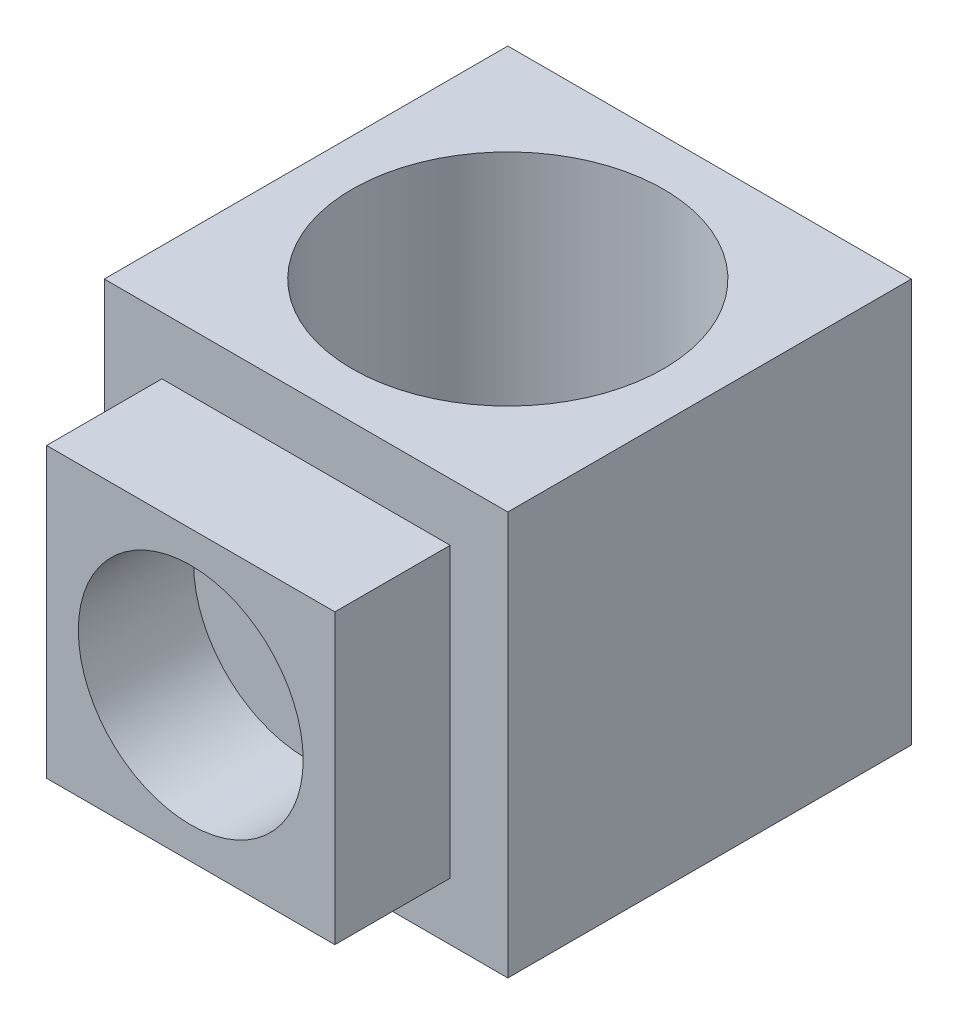
ISO-10303-21;
HEADER;
FILE_DESCRIPTION(('STEP AP214'),'2;1');
FILE_NAME('part.step','',(''),(''),'','','');
FILE_SCHEMA(('AUTOMOTIVE_DESIGN { 1 0 10303 214 1 1 1 1 }'));
ENDSEC;
DATA;
#1=APPLICATION_CONTEXT('core data for automotive mechanical design processes');
#2=APPLICATION_PROTOCOL_DEFINITION('international standard','automotive_design',2000,#1);
#3=PRODUCT_CONTEXT('',#1,'mechanical');
#4=PRODUCT('Part','Part','',(#3));
#5=PRODUCT_RELATED_PRODUCT_CATEGORY('part','',(#4));
#6=PRODUCT_DEFINITION_FORMATION('','',#4);
#7=PRODUCT_DEFINITION_CONTEXT('part definition',#1,'design');
#8=PRODUCT_DEFINITION('design','',#6,#7);
#9=PRODUCT_DEFINITION_SHAPE('','',#8);
#10=(LENGTH_UNIT() NAMED_UNIT(*) SI_UNIT(.MILLI.,.METRE.));
#11=(NAMED_UNIT(*) PLANE_ANGLE_UNIT() SI_UNIT($,.RADIAN.));
#12=(NAMED_UNIT(*) SI_UNIT($,.STERADIAN.) SOLID_ANGLE_UNIT());
#13=UNCERTAINTY_MEASURE_WITH_UNIT(LENGTH_MEASURE(1.E-05),#10,'distance_accuracy_value','');
#14=(GEOMETRIC_REPRESENTATION_CONTEXT(3) GLOBAL_UNCERTAINTY_ASSIGNED_CONTEXT((#13)) GLOBAL_UNIT_ASSIGNED_CONTEXT((#10,
#11,#12)) REPRESENTATION_CONTEXT('',''));
#15=CARTESIAN_POINT('',(0.,0.,0.));
#16=DIRECTION('',(0.,0.,1.));
#17=DIRECTION('',(1.,0.,0.));
#18=AXIS2_PLACEMENT_3D('',#15,#16,#17);
#19=CARTESIAN_POINT('',(0.,14.,0.));
#20=DIRECTION('',(1.,0.,0.));
#21=DIRECTION('',(0.,0.,-1.));
#22=AXIS2_PLACEMENT_3D('',#19,#20,#21);
#23=PLANE('',#22);
#24=DIRECTION('',(0.,0.,1.));
#25=VECTOR('',#24,1.);
#26=CARTESIAN_POINT('',(0.,0.,0.));
#27=LINE('',#26,#25);
#28=CARTESIAN_POINT('',(0.,0.,-14.));
#29=VERTEX_POINT('',#28);
#30=CARTESIAN_POINT('',(0.,0.,0.));
#31=VERTEX_POINT('',#30);
#32=EDGE_CURVE('E135',#29,#31,#27,.T.);
#33=ORIENTED_EDGE('',*,*,#32,.T.);
#34=DIRECTION('',(0.,-1.,0.));
#35=VECTOR('',#34,1.);
#36=CARTESIAN_POINT('',(0.,14.,0.));
#37=LINE('',#36,#35);
#38=CARTESIAN_POINT('',(0.,14.,0.));
#39=VERTEX_POINT('',#38);
#40=EDGE_CURVE('E11',#39,#31,#37,.T.);
#41=ORIENTED_EDGE('',*,*,#40,.F.);
#42=DIRECTION('',(0.,0.,1.));
#43=VECTOR('',#42,1.);
#44=CARTESIAN_POINT('',(0.,14.,0.));
#45=LINE('',#44,#43);
#46=CARTESIAN_POINT('',(0.,14.,-14.));
#47=VERTEX_POINT('',#46);
#48=EDGE_CURVE('E146',#47,#39,#45,.T.);
#49=ORIENTED_EDGE('',*,*,#48,.F.);
#50=DIRECTION('',(0.,-1.,0.));
#51=VECTOR('',#50,1.);
#52=CARTESIAN_POINT('',(0.,14.,-14.));
#53=LINE('',#52,#51);
#54=EDGE_CURVE('E159',#47,#29,#53,.T.);
#55=ORIENTED_EDGE('',*,*,#54,.T.);
#56=EDGE_LOOP('',(#33,#41,#49,#55));
#57=FACE_BOUND('',#56,.T.);
#58=ADVANCED_FACE('F45',(#57),#23,.F.);
#59=CARTESIAN_POINT('',(0.,14.,0.));
#60=DIRECTION('',(0.,0.,-1.));
#61=DIRECTION('',(-1.,0.,0.));
#62=AXIS2_PLACEMENT_3D('',#59,#60,#61);
#63=PLANE('',#62);
#64=DIRECTION('',(0.,-1.,0.));
#65=VECTOR('',#64,1.);
#66=CARTESIAN_POINT('',(2.,12.,0.));
#67=LINE('',#66,#65);
#68=CARTESIAN_POINT('',(2.,12.,0.));
#69=VERTEX_POINT('',#68);
#70=CARTESIAN_POINT('',(2.,2.,0.));
#71=VERTEX_POINT('',#70);
#72=EDGE_CURVE('E133',#69,#71,#67,.T.);
#73=ORIENTED_EDGE('',*,*,#72,.F.);
#74=DIRECTION('',(-1.,0.,0.));
#75=VECTOR('',#74,1.);
#76=CARTESIAN_POINT('',(2.,12.,0.));
#77=LINE('',#76,#75);
#78=CARTESIAN_POINT('',(12.,12.,0.));
#79=VERTEX_POINT('',#78);
#80=EDGE_CURVE('E130',#79,#69,#77,.T.);
#81=ORIENTED_EDGE('',*,*,#80,.F.);
#82=DIRECTION('',(0.,1.,0.));
#83=VECTOR('',#82,1.);
#84=CARTESIAN_POINT('',(12.,12.,0.));
#85=LINE('',#84,#83);
#86=CARTESIAN_POINT('',(12.,2.,0.));
#87=VERTEX_POINT('',#86);
#88=EDGE_CURVE('E65',#87,#79,#85,.T.);
#89=ORIENTED_EDGE('',*,*,#88,.F.);
#90=DIRECTION('',(1.,0.,0.));
#91=VECTOR('',#90,1.);
#92=CARTESIAN_POINT('',(2.,2.,0.));
#93=LINE('',#92,#91);
#94=EDGE_CURVE('E60',#71,#87,#93,.T.);
#95=ORIENTED_EDGE('',*,*,#94,.F.);
#96=EDGE_LOOP('',(#73,#81,#89,#95));
#97=FACE_BOUND('',#96,.T.);
#98=DIRECTION('',(1.,0.,0.));
#99=VECTOR('',#98,1.);
#100=CARTESIAN_POINT('',(0.,0.,0.));
#101=LINE('',#100,#99);
#102=CARTESIAN_POINT('',(14.,0.,0.));
#103=VERTEX_POINT('',#102);
#104=EDGE_CURVE('E140',#31,#103,#101,.T.);
#105=ORIENTED_EDGE('',*,*,#104,.T.);
#106=DIRECTION('',(0.,-1.,0.));
#107=VECTOR('',#106,1.);
#108=CARTESIAN_POINT('',(14.,14.,0.));
#109=LINE('',#108,#107);
#110=CARTESIAN_POINT('',(14.,14.,0.));
#111=VERTEX_POINT('',#110);
#112=EDGE_CURVE('E53',#111,#103,#109,.T.);
#113=ORIENTED_EDGE('',*,*,#112,.F.);
#114=DIRECTION('',(1.,0.,0.));
#115=VECTOR('',#114,1.);
#116=CARTESIAN_POINT('',(0.,14.,0.));
#117=LINE('',#116,#115);
#118=EDGE_CURVE('E150',#39,#111,#117,.T.);
#119=ORIENTED_EDGE('',*,*,#118,.F.);
#120=ORIENTED_EDGE('',*,*,#40,.T.);
#121=EDGE_LOOP('',(#105,#113,#119,#120));
#122=FACE_BOUND('',#121,.T.);
#123=ADVANCED_FACE('F196',(#97,#122),#63,.F.);
#124=CARTESIAN_POINT('',(14.,14.,0.));
#125=DIRECTION('',(-1.,0.,0.));
#126=DIRECTION('',(0.,0.,1.));
#127=AXIS2_PLACEMENT_3D('',#124,#125,#126);
#128=PLANE('',#127);
#129=DIRECTION('',(0.,0.,-1.));
#130=VECTOR('',#129,1.);
#131=CARTESIAN_POINT('',(14.,0.,0.));
#132=LINE('',#131,#130);
#133=CARTESIAN_POINT('',(14.,0.,-14.));
#134=VERTEX_POINT('',#133);
#135=EDGE_CURVE('E163',#103,#134,#132,.T.);
#136=ORIENTED_EDGE('',*,*,#135,.T.);
#137=DIRECTION('',(0.,-1.,0.));
#138=VECTOR('',#137,1.);
#139=CARTESIAN_POINT('',(14.,14.,-14.));
#140=LINE('',#139,#138);
#141=CARTESIAN_POINT('',(14.,14.,-14.));
#142=VERTEX_POINT('',#141);
#143=EDGE_CURVE('E171',#142,#134,#140,.T.);
#144=ORIENTED_EDGE('',*,*,#143,.F.);
#145=DIRECTION('',(0.,0.,-1.));
#146=VECTOR('',#145,1.);
#147=CARTESIAN_POINT('',(14.,14.,0.));
#148=LINE('',#147,#146);
#149=EDGE_CURVE('E154',#111,#142,#148,.T.);
#150=ORIENTED_EDGE('',*,*,#149,.F.);
#151=ORIENTED_EDGE('',*,*,#112,.T.);
#152=EDGE_LOOP('',(#136,#144,#150,#151));
#153=FACE_BOUND('',#152,.T.);
#154=ADVANCED_FACE('F180',(#153),#128,.F.);
#155=CARTESIAN_POINT('',(0.,14.,-14.));
#156=DIRECTION('',(0.,0.,1.));
#157=DIRECTION('',(1.,0.,0.));
#158=AXIS2_PLACEMENT_3D('',#155,#156,#157);
#159=PLANE('',#158);
#160=DIRECTION('',(-1.,0.,0.));
#161=VECTOR('',#160,1.);
#162=CARTESIAN_POINT('',(0.,0.,-14.));
#163=LINE('',#162,#161);
#164=EDGE_CURVE('E151',#134,#29,#163,.T.);
#165=ORIENTED_EDGE('',*,*,#164,.T.);
#166=ORIENTED_EDGE('',*,*,#54,.F.);
#167=DIRECTION('',(-1.,0.,0.));
#168=VECTOR('',#167,1.);
#169=CARTESIAN_POINT('',(0.,14.,-14.));
#170=LINE('',#169,#168);
#171=EDGE_CURVE('E157',#142,#47,#170,.T.);
#172=ORIENTED_EDGE('',*,*,#171,.F.);
#173=ORIENTED_EDGE('',*,*,#143,.T.);
#174=EDGE_LOOP('',(#165,#166,#172,#173));
#175=FACE_BOUND('',#174,.T.);
#176=ADVANCED_FACE('F189',(#175),#159,.F.);
#177=CARTESIAN_POINT('',(0.,14.,0.));
#178=DIRECTION('',(0.,-1.,0.));
#179=DIRECTION('',(0.,0.,-1.));
#180=AXIS2_PLACEMENT_3D('',#177,#178,#179);
#181=PLANE('',#180);
#182=CARTESIAN_POINT('',(7.,14.,-7.));
#183=DIRECTION('',(0.,1.,0.));
#184=DIRECTION('',(0.,0.,1.));
#185=AXIS2_PLACEMENT_3D('',#182,#183,#184);
#186=CIRCLE('',#185,5.4);
#187=CARTESIAN_POINT('',(7.,14.,-1.6));
#188=VERTEX_POINT('',#187);
#189=EDGE_CURVE('E233',#188,#188,#186,.T.);
#190=ORIENTED_EDGE('',*,*,#189,.F.);
#191=EDGE_LOOP('',(#190));
#192=FACE_BOUND('',#191,.T.);
#193=ORIENTED_EDGE('',*,*,#48,.T.);
#194=ORIENTED_EDGE('',*,*,#118,.T.);
#195=ORIENTED_EDGE('',*,*,#149,.T.);
#196=ORIENTED_EDGE('',*,*,#171,.T.);
#197=EDGE_LOOP('',(#193,#194,#195,#196));
#198=FACE_BOUND('',#197,.T.);
#199=ADVANCED_FACE('F195',(#192,#198),#181,.F.);
#200=CARTESIAN_POINT('',(0.,0.,0.));
#201=DIRECTION('',(0.,-1.,0.));
#202=DIRECTION('',(0.,0.,-1.));
#203=AXIS2_PLACEMENT_3D('',#200,#201,#202);
#204=PLANE('',#203);
#205=CARTESIAN_POINT('',(7.,0.,-7.));
#206=DIRECTION('',(0.,-1.,0.));
#207=DIRECTION('',(0.,0.,-1.));
#208=AXIS2_PLACEMENT_3D('',#205,#206,#207);
#209=CIRCLE('',#208,5.4);
#210=CARTESIAN_POINT('',(7.,0.,-1.6));
#211=VERTEX_POINT('',#210);
#212=EDGE_CURVE('E226',#211,#211,#209,.F.);
#213=ORIENTED_EDGE('',*,*,#212,.T.);
#214=EDGE_LOOP('',(#213));
#215=FACE_BOUND('',#214,.T.);
#216=ORIENTED_EDGE('',*,*,#32,.F.);
#217=ORIENTED_EDGE('',*,*,#164,.F.);
#218=ORIENTED_EDGE('',*,*,#135,.F.);
#219=ORIENTED_EDGE('',*,*,#104,.F.);
#220=EDGE_LOOP('',(#216,#217,#218,#219));
#221=FACE_BOUND('',#220,.T.);
#222=ADVANCED_FACE('F186',(#215,#221),#204,.T.);
#223=CARTESIAN_POINT('',(0.,0.,4.));
#224=DIRECTION('',(0.,0.,1.));
#225=DIRECTION('',(1.,0.,0.));
#226=AXIS2_PLACEMENT_3D('',#223,#224,#225);
#227=PLANE('',#226);
#228=DIRECTION('',(0.,-1.,0.));
#229=VECTOR('',#228,1.);
#230=CARTESIAN_POINT('',(2.,12.,4.));
#231=LINE('',#230,#229);
#232=CARTESIAN_POINT('',(2.,12.,4.));
#233=VERTEX_POINT('',#232);
#234=CARTESIAN_POINT('',(2.,2.,4.));
#235=VERTEX_POINT('',#234);
#236=EDGE_CURVE('E119',#233,#235,#231,.T.);
#237=ORIENTED_EDGE('',*,*,#236,.T.);
#238=DIRECTION('',(1.,0.,0.));
#239=VECTOR('',#238,1.);
#240=CARTESIAN_POINT('',(2.,2.,4.));
#241=LINE('',#240,#239);
#242=CARTESIAN_POINT('',(12.,2.,4.));
#243=VERTEX_POINT('',#242);
#244=EDGE_CURVE('E107',#235,#243,#241,.T.);
#245=ORIENTED_EDGE('',*,*,#244,.T.);
#246=DIRECTION('',(0.,1.,0.));
#247=VECTOR('',#246,1.);
#248=CARTESIAN_POINT('',(12.,12.,4.));
#249=LINE('',#248,#247);
#250=CARTESIAN_POINT('',(12.,12.,4.));
#251=VERTEX_POINT('',#250);
#252=EDGE_CURVE('E118',#243,#251,#249,.T.);
#253=ORIENTED_EDGE('',*,*,#252,.T.);
#254=DIRECTION('',(-1.,0.,0.));
#255=VECTOR('',#254,1.);
#256=CARTESIAN_POINT('',(2.,12.,4.));
#257=LINE('',#256,#255);
#258=EDGE_CURVE('E125',#251,#233,#257,.T.);
#259=ORIENTED_EDGE('',*,*,#258,.T.);
#260=EDGE_LOOP('',(#237,#245,#253,#259));
#261=FACE_BOUND('',#260,.T.);
#262=CARTESIAN_POINT('',(7.,7.,4.));
#263=DIRECTION('',(0.,0.,1.));
#264=DIRECTION('',(1.,0.,0.));
#265=AXIS2_PLACEMENT_3D('',#262,#263,#264);
#266=CIRCLE('',#265,3.9);
#267=CARTESIAN_POINT('',(10.9,7.,4.));
#268=VERTEX_POINT('',#267);
#269=EDGE_CURVE('E225',#268,#268,#266,.T.);
#270=ORIENTED_EDGE('',*,*,#269,.F.);
#271=EDGE_LOOP('',(#270));
#272=FACE_BOUND('',#271,.T.);
#273=ADVANCED_FACE('F122',(#261,#272),#227,.T.);
#274=CARTESIAN_POINT('',(2.,12.,4.));
#275=DIRECTION('',(1.,0.,0.));
#276=DIRECTION('',(0.,1.,0.));
#277=AXIS2_PLACEMENT_3D('',#274,#275,#276);
#278=PLANE('',#277);
#279=ORIENTED_EDGE('',*,*,#72,.T.);
#280=DIRECTION('',(0.,0.,-1.));
#281=VECTOR('',#280,1.);
#282=CARTESIAN_POINT('',(2.,2.,4.));
#283=LINE('',#282,#281);
#284=EDGE_CURVE('E111',#235,#71,#283,.T.);
#285=ORIENTED_EDGE('',*,*,#284,.F.);
#286=ORIENTED_EDGE('',*,*,#236,.F.);
#287=DIRECTION('',(0.,0.,-1.));
#288=VECTOR('',#287,1.);
#289=CARTESIAN_POINT('',(2.,12.,4.));
#290=LINE('',#289,#288);
#291=EDGE_CURVE('E240',#233,#69,#290,.T.);
#292=ORIENTED_EDGE('',*,*,#291,.T.);
#293=EDGE_LOOP('',(#279,#285,#286,#292));
#294=FACE_BOUND('',#293,.T.);
#295=ADVANCED_FACE('F132',(#294),#278,.F.);
#296=CARTESIAN_POINT('',(2.,2.,4.));
#297=DIRECTION('',(0.,1.,0.));
#298=DIRECTION('',(-1.,0.,0.));
#299=AXIS2_PLACEMENT_3D('',#296,#297,#298);
#300=PLANE('',#299);
#301=ORIENTED_EDGE('',*,*,#94,.T.);
#302=DIRECTION('',(0.,0.,-1.));
#303=VECTOR('',#302,1.);
#304=CARTESIAN_POINT('',(12.,2.,4.));
#305=LINE('',#304,#303);
#306=EDGE_CURVE('E114',#243,#87,#305,.T.);
#307=ORIENTED_EDGE('',*,*,#306,.F.);
#308=ORIENTED_EDGE('',*,*,#244,.F.);
#309=ORIENTED_EDGE('',*,*,#284,.T.);
#310=EDGE_LOOP('',(#301,#307,#308,#309));
#311=FACE_BOUND('',#310,.T.);
#312=ADVANCED_FACE('F109',(#311),#300,.F.);
#313=CARTESIAN_POINT('',(12.,12.,4.));
#314=DIRECTION('',(-1.,0.,0.));
#315=DIRECTION('',(0.,0.,1.));
#316=AXIS2_PLACEMENT_3D('',#313,#314,#315);
#317=PLANE('',#316);
#318=ORIENTED_EDGE('',*,*,#88,.T.);
#319=DIRECTION('',(0.,0.,-1.));
#320=VECTOR('',#319,1.);
#321=CARTESIAN_POINT('',(12.,12.,4.));
#322=LINE('',#321,#320);
#323=EDGE_CURVE('E142',#251,#79,#322,.T.);
#324=ORIENTED_EDGE('',*,*,#323,.F.);
#325=ORIENTED_EDGE('',*,*,#252,.F.);
#326=ORIENTED_EDGE('',*,*,#306,.T.);
#327=EDGE_LOOP('',(#318,#324,#325,#326));
#328=FACE_BOUND('',#327,.T.);
#329=ADVANCED_FACE('F256',(#328),#317,.F.);
#330=CARTESIAN_POINT('',(2.,12.,4.));
#331=DIRECTION('',(0.,-1.,0.));
#332=DIRECTION('',(1.,0.,0.));
#333=AXIS2_PLACEMENT_3D('',#330,#331,#332);
#334=PLANE('',#333);
#335=ORIENTED_EDGE('',*,*,#80,.T.);
#336=ORIENTED_EDGE('',*,*,#291,.F.);
#337=ORIENTED_EDGE('',*,*,#258,.F.);
#338=ORIENTED_EDGE('',*,*,#323,.T.);
#339=EDGE_LOOP('',(#335,#336,#337,#338));
#340=FACE_BOUND('',#339,.T.);
#341=ADVANCED_FACE('F217',(#340),#334,.F.);
#342=CARTESIAN_POINT('',(7.,7.,4.));
#343=DIRECTION('',(0.,0.,-1.));
#344=DIRECTION('',(-1.,0.,0.));
#345=AXIS2_PLACEMENT_3D('',#342,#343,#344);
#346=CYLINDRICAL_SURFACE('',#345,3.9);
#347=ORIENTED_EDGE('',*,*,#269,.T.);
#348=EDGE_LOOP('',(#347));
#349=FACE_BOUND('',#348,.T.);
#350=CARTESIAN_POINT('',(7.,7.,0.));
#351=DIRECTION('',(0.,0.,1.));
#352=DIRECTION('',(1.,0.,0.));
#353=AXIS2_PLACEMENT_3D('',#350,#351,#352);
#354=CIRCLE('',#353,3.9);
#355=CARTESIAN_POINT('',(10.9,7.,0.));
#356=VERTEX_POINT('',#355);
#357=EDGE_CURVE('E222',#356,#356,#354,.T.);
#358=ORIENTED_EDGE('',*,*,#357,.F.);
#359=EDGE_LOOP('',(#358));
#360=FACE_BOUND('',#359,.T.);
#361=ADVANCED_FACE('F208',(#349,#360),#346,.F.);
#362=ORIENTED_EDGE('',*,*,#357,.T.);
#363=EDGE_LOOP('',(#362));
#364=FACE_BOUND('',#363,.T.);
#365=ADVANCED_FACE('F198',(#364),#63,.F.);
#366=CARTESIAN_POINT('',(7.,-15.2735064736294,-7.));
#367=DIRECTION('',(0.,1.,0.));
#368=DIRECTION('',(0.,0.,1.));
#369=AXIS2_PLACEMENT_3D('',#366,#367,#368);
#370=CYLINDRICAL_SURFACE('',#369,5.4);
#371=CARTESIAN_POINT('',(7.,14.,-1.6));
#372=CARTESIAN_POINT('',(7.,13.8541666666667,-1.6));
#373=CARTESIAN_POINT('',(7.,13.7083333333333,-1.6));
#374=CARTESIAN_POINT('',(7.,13.4166666666667,-1.6));
#375=CARTESIAN_POINT('',(7.,13.2708333333333,-1.6));
#376=CARTESIAN_POINT('',(7.,12.9791666666667,-1.6));
#377=CARTESIAN_POINT('',(7.,12.8333333333333,-1.6));
#378=CARTESIAN_POINT('',(7.,12.5416666666667,-1.6));
#379=CARTESIAN_POINT('',(7.,12.3958333333333,-1.6));
#380=CARTESIAN_POINT('',(7.,12.1041666666667,-1.6));
#381=CARTESIAN_POINT('',(7.,11.9583333333333,-1.6));
#382=CARTESIAN_POINT('',(7.,11.6666666666667,-1.6));
#383=CARTESIAN_POINT('',(7.,11.5208333333333,-1.6));
#384=CARTESIAN_POINT('',(7.,11.2291666666667,-1.6));
#385=CARTESIAN_POINT('',(7.,11.0833333333333,-1.6));
#386=CARTESIAN_POINT('',(7.,10.7916666666667,-1.6));
#387=CARTESIAN_POINT('',(7.,10.6458333333333,-1.6));
#388=CARTESIAN_POINT('',(7.,10.3541666666667,-1.6));
#389=CARTESIAN_POINT('',(7.,10.2083333333333,-1.6));
#390=CARTESIAN_POINT('',(7.,9.91666666666667,-1.6));
#391=CARTESIAN_POINT('',(7.,9.77083333333333,-1.6));
#392=CARTESIAN_POINT('',(7.,9.47916666666667,-1.6));
#393=CARTESIAN_POINT('',(7.,9.33333333333333,-1.6));
#394=CARTESIAN_POINT('',(7.,9.04166666666667,-1.6));
#395=CARTESIAN_POINT('',(7.,8.89583333333333,-1.6));
#396=CARTESIAN_POINT('',(7.,8.60416666666667,-1.6));
#397=CARTESIAN_POINT('',(7.,8.45833333333333,-1.6));
#398=CARTESIAN_POINT('',(7.,8.16666666666667,-1.6));
#399=CARTESIAN_POINT('',(7.,8.02083333333333,-1.6));
#400=CARTESIAN_POINT('',(7.,7.72916666666667,-1.6));
#401=CARTESIAN_POINT('',(7.,7.58333333333333,-1.6));
#402=CARTESIAN_POINT('',(7.,7.29166666666667,-1.6));
#403=CARTESIAN_POINT('',(7.,7.14583333333333,-1.6));
#404=CARTESIAN_POINT('',(7.,6.85416666666667,-1.6));
#405=CARTESIAN_POINT('',(7.,6.70833333333333,-1.6));
#406=CARTESIAN_POINT('',(7.,6.41666666666667,-1.6));
#407=CARTESIAN_POINT('',(7.,6.27083333333333,-1.6));
#408=CARTESIAN_POINT('',(7.,5.97916666666667,-1.6));
#409=CARTESIAN_POINT('',(7.,5.83333333333333,-1.6));
#410=CARTESIAN_POINT('',(7.,5.54166666666667,-1.6));
#411=CARTESIAN_POINT('',(7.,5.39583333333333,-1.6));
#412=CARTESIAN_POINT('',(7.,5.10416666666667,-1.6));
#413=CARTESIAN_POINT('',(7.,4.95833333333333,-1.6));
#414=CARTESIAN_POINT('',(7.,4.66666666666667,-1.6));
#415=CARTESIAN_POINT('',(7.,4.52083333333333,-1.6));
#416=CARTESIAN_POINT('',(7.,4.22916666666667,-1.6));
#417=CARTESIAN_POINT('',(7.,4.08333333333333,-1.6));
#418=CARTESIAN_POINT('',(7.,3.79166666666667,-1.6));
#419=CARTESIAN_POINT('',(7.,3.64583333333333,-1.6));
#420=CARTESIAN_POINT('',(7.,3.35416666666666,-1.6));
#421=CARTESIAN_POINT('',(7.,3.20833333333333,-1.6));
#422=CARTESIAN_POINT('',(7.,2.91666666666666,-1.6));
#423=CARTESIAN_POINT('',(7.,2.77083333333333,-1.6));
#424=CARTESIAN_POINT('',(7.,2.47916666666666,-1.6));
#425=CARTESIAN_POINT('',(7.,2.33333333333333,-1.6));
#426=CARTESIAN_POINT('',(7.,2.04166666666666,-1.6));
#427=CARTESIAN_POINT('',(7.,1.89583333333333,-1.6));
#428=CARTESIAN_POINT('',(7.,1.60416666666666,-1.6));
#429=CARTESIAN_POINT('',(7.,1.45833333333333,-1.6));
#430=CARTESIAN_POINT('',(7.,1.16666666666666,-1.6));
#431=CARTESIAN_POINT('',(7.,1.02083333333333,-1.6));
#432=CARTESIAN_POINT('',(7.,0.729166666666666,-1.6));
#433=CARTESIAN_POINT('',(7.,0.583333333333332,-1.6));
#434=CARTESIAN_POINT('',(7.,0.291666666666666,-1.6));
#435=CARTESIAN_POINT('',(7.,0.145833333333333,-1.6));
#436=CARTESIAN_POINT('',(7.,0.,-1.6));
#437=B_SPLINE_CURVE_WITH_KNOTS('',3,(#371,#372,#373,#374,#375,#376,#377,#378,#379,#380,#381,
#382,#383,#384,#385,#386,#387,#388,#389,#390,#391,#392,#393,#394,#395,#396,#397,#398,#399,#400,
#401,#402,#403,#404,#405,#406,#407,#408,#409,#410,#411,#412,#413,#414,#415,#416,#417,#418,#419,
#420,#421,#422,#423,#424,#425,#426,#427,#428,#429,#430,#431,#432,#433,#434,#435,#436),
.UNSPECIFIED.,.F.,.F.,(4,2,2,2,2,2,2,2,2,2,2,2,2,2,2,2,2,2,2,2,2,2,2,2,2,2,2,2,2,2,2,2,4),(0.,
0.4375,0.875000000000001,1.3125,1.75,2.1875,2.625,3.0625,3.5,3.9375,4.375,4.8125,5.25,5.6875,
6.125,6.5625,7.,7.4375,7.875,8.3125,8.75,9.1875,9.625,10.0625,10.5,10.9375,11.375,11.8125,12.25,
12.6875,13.125,13.5625,14.),.UNSPECIFIED.);
#438=EDGE_CURVE('BSEAM207',#188,#211,#437,.T.);
#439=ORIENTED_EDGE('',*,*,#189,.T.);
#440=ORIENTED_EDGE('',*,*,#212,.F.);
#441=ORIENTED_EDGE('',*,*,#438,.T.);
#442=ORIENTED_EDGE('',*,*,#438,.F.);
#443=EDGE_LOOP('',(#439,#441,#440,#442));
#444=FACE_BOUND('',#443,.T.);
#445=ADVANCED_FACE('F207',(#444),#370,.F.);
#446=CLOSED_SHELL('',(#58,#123,#154,#176,#199,#222,#273,#295,#312,#329,#341,#361,#365,#445));
#447=MANIFOLD_SOLID_BREP('B2',#446);
#448=ADVANCED_BREP_SHAPE_REPRESENTATION('',(#18,#447),#14);
#449=SHAPE_DEFINITION_REPRESENTATION(#9,#448);
ENDSEC;
END-ISO-10303-21;
